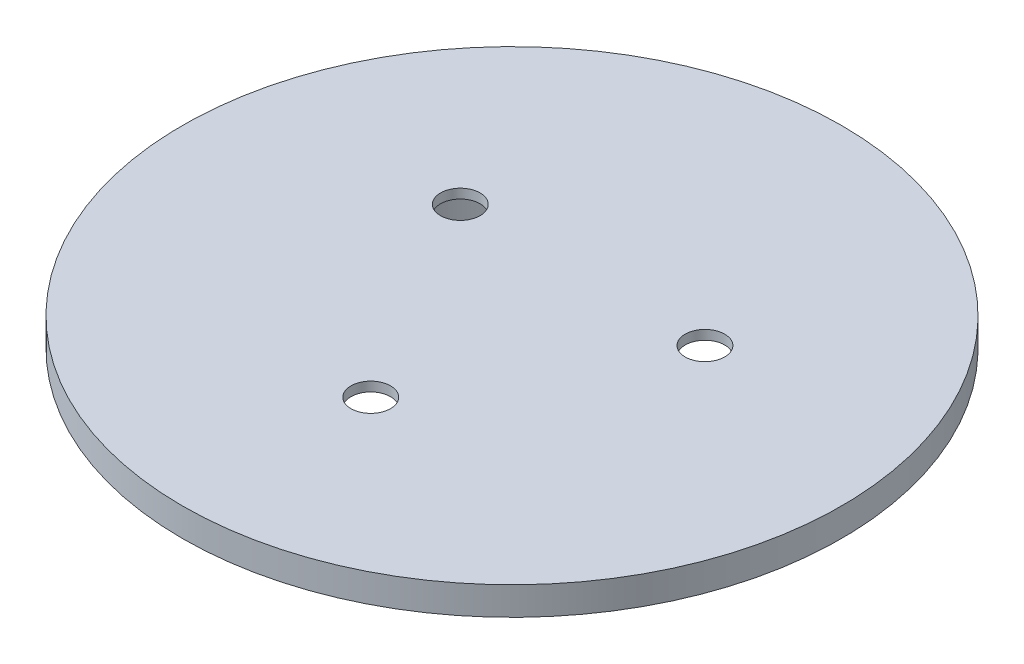
ISO-10303-21;
HEADER;
FILE_DESCRIPTION(('STEP AP214'),'2;1');
FILE_NAME('part.step','',(''),(''),'','','');
FILE_SCHEMA(('AUTOMOTIVE_DESIGN { 1 0 10303 214 1 1 1 1 }'));
ENDSEC;
DATA;
#1=APPLICATION_CONTEXT('core data for automotive mechanical design processes');
#2=APPLICATION_PROTOCOL_DEFINITION('international standard','automotive_design',2000,#1);
#3=PRODUCT_CONTEXT('',#1,'mechanical');
#4=PRODUCT('Part','Part','',(#3));
#5=PRODUCT_RELATED_PRODUCT_CATEGORY('part','',(#4));
#6=PRODUCT_DEFINITION_FORMATION('','',#4);
#7=PRODUCT_DEFINITION_CONTEXT('part definition',#1,'design');
#8=PRODUCT_DEFINITION('design','',#6,#7);
#9=PRODUCT_DEFINITION_SHAPE('','',#8);
#10=(LENGTH_UNIT() NAMED_UNIT(*) SI_UNIT(.MILLI.,.METRE.));
#11=(NAMED_UNIT(*) PLANE_ANGLE_UNIT() SI_UNIT($,.RADIAN.));
#12=(NAMED_UNIT(*) SI_UNIT($,.STERADIAN.) SOLID_ANGLE_UNIT());
#13=UNCERTAINTY_MEASURE_WITH_UNIT(LENGTH_MEASURE(1.E-05),#10,'distance_accuracy_value','');
#14=(GEOMETRIC_REPRESENTATION_CONTEXT(3) GLOBAL_UNCERTAINTY_ASSIGNED_CONTEXT((#13)) GLOBAL_UNIT_ASSIGNED_CONTEXT((#10,
#11,#12)) REPRESENTATION_CONTEXT('',''));
#15=CARTESIAN_POINT('',(0.,0.,0.));
#16=DIRECTION('',(0.,0.,1.));
#17=DIRECTION('',(1.,0.,0.));
#18=AXIS2_PLACEMENT_3D('',#15,#16,#17);
#19=CARTESIAN_POINT('',(0.,4.,0.));
#20=DIRECTION('',(0.,-1.,0.));
#21=DIRECTION('',(0.,0.,-1.));
#22=AXIS2_PLACEMENT_3D('',#19,#20,#21);
#23=CYLINDRICAL_SURFACE('',#22,25.);
#24=CARTESIAN_POINT('',(0.,4.,0.));
#25=DIRECTION('',(0.,1.,0.));
#26=DIRECTION('',(0.,0.,1.));
#27=AXIS2_PLACEMENT_3D('',#24,#25,#26);
#28=CIRCLE('',#27,25.);
#29=CARTESIAN_POINT('',(0.,4.,25.));
#30=VERTEX_POINT('',#29);
#31=EDGE_CURVE('E10',#30,#30,#28,.T.);
#32=ORIENTED_EDGE('',*,*,#31,.F.);
#33=EDGE_LOOP('',(#32));
#34=FACE_BOUND('',#33,.T.);
#35=CARTESIAN_POINT('',(0.,0.,0.));
#36=DIRECTION('',(0.,1.,0.));
#37=DIRECTION('',(0.,0.,1.));
#38=AXIS2_PLACEMENT_3D('',#35,#36,#37);
#39=CIRCLE('',#38,25.);
#40=CARTESIAN_POINT('',(0.,0.,25.));
#41=VERTEX_POINT('',#40);
#42=EDGE_CURVE('E34',#41,#41,#39,.T.);
#43=ORIENTED_EDGE('',*,*,#42,.T.);
#44=EDGE_LOOP('',(#43));
#45=FACE_BOUND('',#44,.T.);
#46=ADVANCED_FACE('F31',(#34,#45),#23,.T.);
#47=CARTESIAN_POINT('',(0.,0.,0.));
#48=DIRECTION('',(0.,1.,0.));
#49=DIRECTION('',(0.,0.,1.));
#50=AXIS2_PLACEMENT_3D('',#47,#48,#49);
#51=PLANE('',#50);
#52=CARTESIAN_POINT('',(0.,0.,0.));
#53=DIRECTION('',(0.,-1.,0.));
#54=DIRECTION('',(0.,0.,-1.));
#55=AXIS2_PLACEMENT_3D('',#52,#53,#54);
#56=CIRCLE('',#55,20.05);
#57=CARTESIAN_POINT('',(0.,0.,-20.05));
#58=VERTEX_POINT('',#57);
#59=EDGE_CURVE('E49',#58,#58,#56,.T.);
#60=ORIENTED_EDGE('',*,*,#59,.F.);
#61=EDGE_LOOP('',(#60));
#62=FACE_BOUND('',#61,.T.);
#63=ORIENTED_EDGE('',*,*,#42,.F.);
#64=EDGE_LOOP('',(#63));
#65=FACE_BOUND('',#64,.T.);
#66=ADVANCED_FACE('F93',(#62,#65),#51,.F.);
#67=CARTESIAN_POINT('',(0.,7.,0.));
#68=DIRECTION('',(0.,-1.,0.));
#69=DIRECTION('',(0.,0.,-1.));
#70=AXIS2_PLACEMENT_3D('',#67,#68,#69);
#71=CYLINDRICAL_SURFACE('',#70,35.);
#72=CARTESIAN_POINT('',(0.,7.,0.));
#73=DIRECTION('',(0.,1.,0.));
#74=DIRECTION('',(0.,0.,1.));
#75=AXIS2_PLACEMENT_3D('',#72,#73,#74);
#76=CIRCLE('',#75,35.);
#77=CARTESIAN_POINT('',(0.,7.,35.));
#78=VERTEX_POINT('',#77);
#79=EDGE_CURVE('E41',#78,#78,#76,.T.);
#80=ORIENTED_EDGE('',*,*,#79,.F.);
#81=EDGE_LOOP('',(#80));
#82=FACE_BOUND('',#81,.T.);
#83=CARTESIAN_POINT('',(0.,4.,0.));
#84=DIRECTION('',(0.,1.,0.));
#85=DIRECTION('',(0.,0.,1.));
#86=AXIS2_PLACEMENT_3D('',#83,#84,#85);
#87=CIRCLE('',#86,35.);
#88=CARTESIAN_POINT('',(0.,4.,35.));
#89=VERTEX_POINT('',#88);
#90=EDGE_CURVE('E43',#89,#89,#87,.T.);
#91=ORIENTED_EDGE('',*,*,#90,.T.);
#92=EDGE_LOOP('',(#91));
#93=FACE_BOUND('',#92,.T.);
#94=ADVANCED_FACE('F96',(#82,#93),#71,.T.);
#95=CARTESIAN_POINT('',(0.,7.,0.));
#96=DIRECTION('',(0.,1.,0.));
#97=DIRECTION('',(0.,0.,1.));
#98=AXIS2_PLACEMENT_3D('',#95,#96,#97);
#99=PLANE('',#98);
#100=CARTESIAN_POINT('',(0.,7.,15.));
#101=DIRECTION('',(0.,1.,0.));
#102=DIRECTION('',(0.,0.,1.));
#103=AXIS2_PLACEMENT_3D('',#100,#101,#102);
#104=CIRCLE('',#103,2.1);
#105=CARTESIAN_POINT('',(0.,7.,17.1));
#106=VERTEX_POINT('',#105);
#107=EDGE_CURVE('E67',#106,#106,#104,.F.);
#108=ORIENTED_EDGE('',*,*,#107,.T.);
#109=EDGE_LOOP('',(#108));
#110=FACE_BOUND('',#109,.T.);
#111=CARTESIAN_POINT('',(-12.9903810567665,7.,-7.50000000000006));
#112=DIRECTION('',(0.,1.,0.));
#113=DIRECTION('',(0.,0.,1.));
#114=AXIS2_PLACEMENT_3D('',#111,#112,#113);
#115=CIRCLE('',#114,2.1);
#116=CARTESIAN_POINT('',(-12.9903810567665,7.,-5.40000000000006));
#117=VERTEX_POINT('',#116);
#118=EDGE_CURVE('E64',#117,#117,#115,.F.);
#119=ORIENTED_EDGE('',*,*,#118,.T.);
#120=EDGE_LOOP('',(#119));
#121=FACE_BOUND('',#120,.T.);
#122=CARTESIAN_POINT('',(12.9903810567665,7.,-7.50000000000006));
#123=DIRECTION('',(0.,1.,0.));
#124=DIRECTION('',(0.,0.,1.));
#125=AXIS2_PLACEMENT_3D('',#122,#123,#124);
#126=CIRCLE('',#125,2.1);
#127=CARTESIAN_POINT('',(12.9903810567665,7.,-5.40000000000006));
#128=VERTEX_POINT('',#127);
#129=EDGE_CURVE('E58',#128,#128,#126,.F.);
#130=ORIENTED_EDGE('',*,*,#129,.T.);
#131=EDGE_LOOP('',(#130));
#132=FACE_BOUND('',#131,.T.);
#133=ORIENTED_EDGE('',*,*,#79,.T.);
#134=EDGE_LOOP('',(#133));
#135=FACE_BOUND('',#134,.T.);
#136=ADVANCED_FACE('F115',(#110,#121,#132,#135),#99,.T.);
#137=CARTESIAN_POINT('',(0.,4.,0.));
#138=DIRECTION('',(0.,1.,0.));
#139=DIRECTION('',(0.,0.,1.));
#140=AXIS2_PLACEMENT_3D('',#137,#138,#139);
#141=PLANE('',#140);
#142=ORIENTED_EDGE('',*,*,#31,.T.);
#143=EDGE_LOOP('',(#142));
#144=FACE_BOUND('',#143,.T.);
#145=ORIENTED_EDGE('',*,*,#90,.F.);
#146=EDGE_LOOP('',(#145));
#147=FACE_BOUND('',#146,.T.);
#148=ADVANCED_FACE('F89',(#144,#147),#141,.F.);
#149=CARTESIAN_POINT('',(0.,6.,0.));
#150=DIRECTION('',(0.,-1.,0.));
#151=DIRECTION('',(0.,0.,-1.));
#152=AXIS2_PLACEMENT_3D('',#149,#150,#151);
#153=CYLINDRICAL_SURFACE('',#152,20.05);
#154=CARTESIAN_POINT('',(0.,6.,0.));
#155=DIRECTION('',(0.,-1.,0.));
#156=DIRECTION('',(0.,0.,-1.));
#157=AXIS2_PLACEMENT_3D('',#154,#155,#156);
#158=CIRCLE('',#157,20.05);
#159=CARTESIAN_POINT('',(0.,6.,-20.05));
#160=VERTEX_POINT('',#159);
#161=EDGE_CURVE('E46',#160,#160,#158,.T.);
#162=ORIENTED_EDGE('',*,*,#161,.F.);
#163=EDGE_LOOP('',(#162));
#164=FACE_BOUND('',#163,.T.);
#165=ORIENTED_EDGE('',*,*,#59,.T.);
#166=EDGE_LOOP('',(#165));
#167=FACE_BOUND('',#166,.T.);
#168=ADVANCED_FACE('F79',(#164,#167),#153,.F.);
#169=CARTESIAN_POINT('',(0.,6.,0.));
#170=DIRECTION('',(0.,-1.,0.));
#171=DIRECTION('',(0.,0.,-1.));
#172=AXIS2_PLACEMENT_3D('',#169,#170,#171);
#173=PLANE('',#172);
#174=CARTESIAN_POINT('',(0.,6.,15.));
#175=DIRECTION('',(0.,-1.,0.));
#176=DIRECTION('',(0.,0.,-1.));
#177=AXIS2_PLACEMENT_3D('',#174,#175,#176);
#178=CIRCLE('',#177,2.1);
#179=CARTESIAN_POINT('',(0.,6.,12.9));
#180=VERTEX_POINT('',#179);
#181=EDGE_CURVE('E52',#180,#180,#178,.T.);
#182=ORIENTED_EDGE('',*,*,#181,.F.);
#183=EDGE_LOOP('',(#182));
#184=FACE_BOUND('',#183,.T.);
#185=CARTESIAN_POINT('',(-12.9903810567665,6.,-7.50000000000006));
#186=DIRECTION('',(0.,-1.,0.));
#187=DIRECTION('',(0.,0.,-1.));
#188=AXIS2_PLACEMENT_3D('',#185,#186,#187);
#189=CIRCLE('',#188,2.1);
#190=CARTESIAN_POINT('',(-12.9903810567665,6.,-9.60000000000006));
#191=VERTEX_POINT('',#190);
#192=EDGE_CURVE('E61',#191,#191,#189,.T.);
#193=ORIENTED_EDGE('',*,*,#192,.F.);
#194=EDGE_LOOP('',(#193));
#195=FACE_BOUND('',#194,.T.);
#196=CARTESIAN_POINT('',(12.9903810567665,6.,-7.50000000000006));
#197=DIRECTION('',(0.,-1.,0.));
#198=DIRECTION('',(0.,0.,-1.));
#199=AXIS2_PLACEMENT_3D('',#196,#197,#198);
#200=CIRCLE('',#199,2.1);
#201=CARTESIAN_POINT('',(12.9903810567665,6.,-9.60000000000006));
#202=VERTEX_POINT('',#201);
#203=EDGE_CURVE('E55',#202,#202,#200,.T.);
#204=ORIENTED_EDGE('',*,*,#203,.F.);
#205=EDGE_LOOP('',(#204));
#206=FACE_BOUND('',#205,.T.);
#207=ORIENTED_EDGE('',*,*,#161,.T.);
#208=EDGE_LOOP('',(#207));
#209=FACE_BOUND('',#208,.T.);
#210=ADVANCED_FACE('F75',(#184,#195,#206,#209),#173,.T.);
#211=CARTESIAN_POINT('',(12.9903810567665,7.001,-7.50000000000006));
#212=DIRECTION('',(0.,-1.,0.));
#213=DIRECTION('',(0.,0.,-1.));
#214=AXIS2_PLACEMENT_3D('',#211,#212,#213);
#215=CYLINDRICAL_SURFACE('',#214,2.1);
#216=ORIENTED_EDGE('',*,*,#129,.F.);
#217=EDGE_LOOP('',(#216));
#218=FACE_BOUND('',#217,.T.);
#219=ORIENTED_EDGE('',*,*,#203,.T.);
#220=EDGE_LOOP('',(#219));
#221=FACE_BOUND('',#220,.T.);
#222=ADVANCED_FACE('F78',(#218,#221),#215,.F.);
#223=CARTESIAN_POINT('',(-12.9903810567665,7.001,-7.50000000000006));
#224=DIRECTION('',(0.,-1.,0.));
#225=DIRECTION('',(0.,0.,-1.));
#226=AXIS2_PLACEMENT_3D('',#223,#224,#225);
#227=CYLINDRICAL_SURFACE('',#226,2.1);
#228=ORIENTED_EDGE('',*,*,#118,.F.);
#229=EDGE_LOOP('',(#228));
#230=FACE_BOUND('',#229,.T.);
#231=ORIENTED_EDGE('',*,*,#192,.T.);
#232=EDGE_LOOP('',(#231));
#233=FACE_BOUND('',#232,.T.);
#234=ADVANCED_FACE('F142',(#230,#233),#227,.F.);
#235=CARTESIAN_POINT('',(0.,7.001,15.));
#236=DIRECTION('',(0.,-1.,0.));
#237=DIRECTION('',(0.,0.,-1.));
#238=AXIS2_PLACEMENT_3D('',#235,#236,#237);
#239=CYLINDRICAL_SURFACE('',#238,2.1);
#240=ORIENTED_EDGE('',*,*,#107,.F.);
#241=EDGE_LOOP('',(#240));
#242=FACE_BOUND('',#241,.T.);
#243=ORIENTED_EDGE('',*,*,#181,.T.);
#244=EDGE_LOOP('',(#243));
#245=FACE_BOUND('',#244,.T.);
#246=ADVANCED_FACE('F73',(#242,#245),#239,.F.);
#247=CLOSED_SHELL('',(#46,#66,#94,#136,#148,#168,#210,#222,#234,#246));
#248=MANIFOLD_SOLID_BREP('B2',#247);
#249=ADVANCED_BREP_SHAPE_REPRESENTATION('',(#18,#248),#14);
#250=SHAPE_DEFINITION_REPRESENTATION(#9,#249);
ENDSEC;
END-ISO-10303-21;
